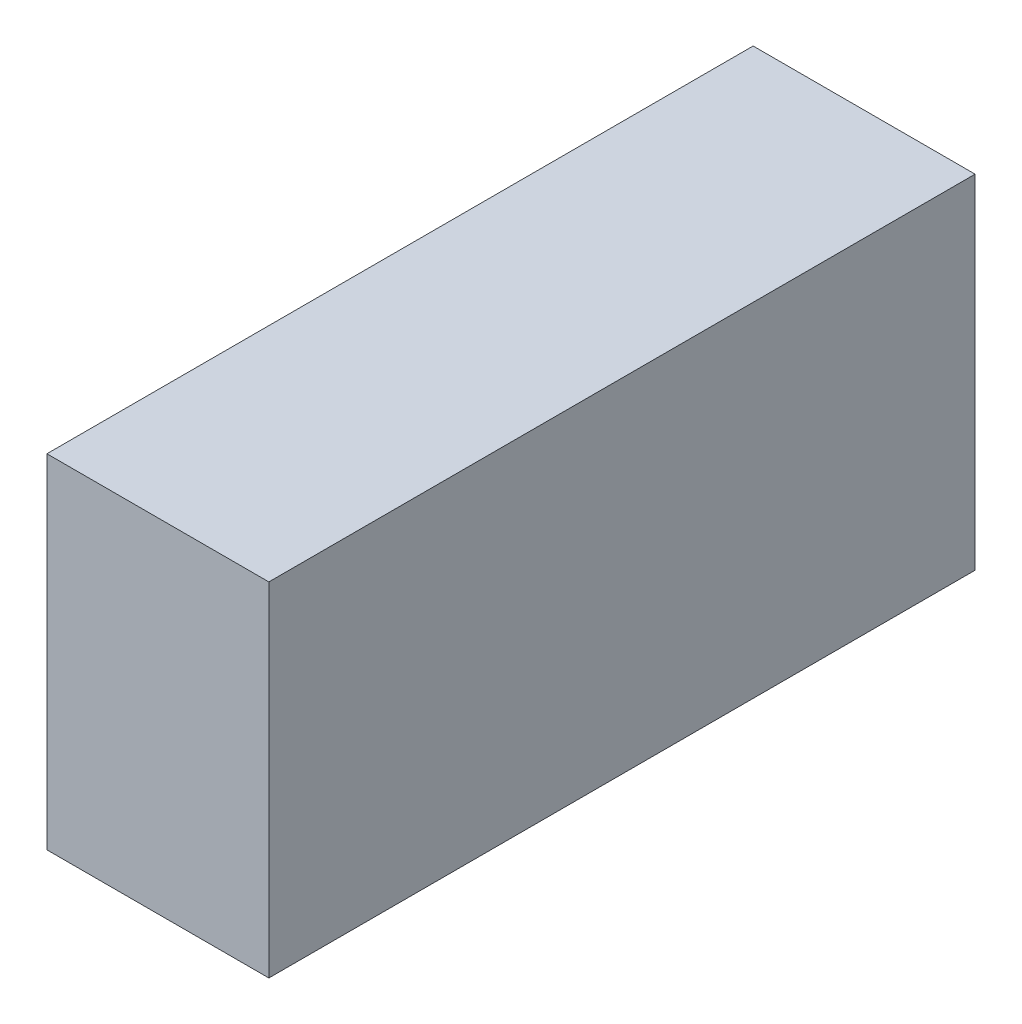
ISO-10303-21;
HEADER;
FILE_DESCRIPTION(('STEP AP214'),'2;1');
FILE_NAME('part.step','',(''),(''),'','','');
FILE_SCHEMA(('AUTOMOTIVE_DESIGN { 1 0 10303 214 1 1 1 1 }'));
ENDSEC;
DATA;
#1=APPLICATION_CONTEXT('core data for automotive mechanical design processes');
#2=APPLICATION_PROTOCOL_DEFINITION('international standard','automotive_design',2000,#1);
#3=PRODUCT_CONTEXT('',#1,'mechanical');
#4=PRODUCT('Part','Part','',(#3));
#5=PRODUCT_RELATED_PRODUCT_CATEGORY('part','',(#4));
#6=PRODUCT_DEFINITION_FORMATION('','',#4);
#7=PRODUCT_DEFINITION_CONTEXT('part definition',#1,'design');
#8=PRODUCT_DEFINITION('design','',#6,#7);
#9=PRODUCT_DEFINITION_SHAPE('','',#8);
#10=(LENGTH_UNIT() NAMED_UNIT(*) SI_UNIT(.MILLI.,.METRE.));
#11=(NAMED_UNIT(*) PLANE_ANGLE_UNIT() SI_UNIT($,.RADIAN.));
#12=(NAMED_UNIT(*) SI_UNIT($,.STERADIAN.) SOLID_ANGLE_UNIT());
#13=UNCERTAINTY_MEASURE_WITH_UNIT(LENGTH_MEASURE(1.E-05),#10,'distance_accuracy_value','');
#14=(GEOMETRIC_REPRESENTATION_CONTEXT(3) GLOBAL_UNCERTAINTY_ASSIGNED_CONTEXT((#13)) GLOBAL_UNIT_ASSIGNED_CONTEXT((#10,
#11,#12)) REPRESENTATION_CONTEXT('',''));
#15=CARTESIAN_POINT('',(0.,0.,0.));
#16=DIRECTION('',(0.,0.,1.));
#17=DIRECTION('',(1.,0.,0.));
#18=AXIS2_PLACEMENT_3D('',#15,#16,#17);
#19=CARTESIAN_POINT('',(11.,-17.,35.));
#20=DIRECTION('',(-1.,0.,0.));
#21=DIRECTION('',(0.,0.,1.));
#22=AXIS2_PLACEMENT_3D('',#19,#20,#21);
#23=PLANE('',#22);
#24=DIRECTION('',(0.,1.,0.));
#25=VECTOR('',#24,1.);
#26=CARTESIAN_POINT('',(11.,-17.,-35.));
#27=LINE('',#26,#25);
#28=CARTESIAN_POINT('',(11.,-17.,-35.));
#29=VERTEX_POINT('',#28);
#30=CARTESIAN_POINT('',(11.,17.,-35.));
#31=VERTEX_POINT('',#30);
#32=EDGE_CURVE('E100',#29,#31,#27,.T.);
#33=ORIENTED_EDGE('',*,*,#32,.T.);
#34=DIRECTION('',(0.,0.,-1.));
#35=VECTOR('',#34,1.);
#36=CARTESIAN_POINT('',(11.,17.,35.));
#37=LINE('',#36,#35);
#38=CARTESIAN_POINT('',(11.,17.,35.));
#39=VERTEX_POINT('',#38);
#40=EDGE_CURVE('E11',#39,#31,#37,.T.);
#41=ORIENTED_EDGE('',*,*,#40,.F.);
#42=DIRECTION('',(0.,1.,0.));
#43=VECTOR('',#42,1.);
#44=CARTESIAN_POINT('',(11.,-17.,35.));
#45=LINE('',#44,#43);
#46=CARTESIAN_POINT('',(11.,-17.,35.));
#47=VERTEX_POINT('',#46);
#48=EDGE_CURVE('E88',#47,#39,#45,.T.);
#49=ORIENTED_EDGE('',*,*,#48,.F.);
#50=DIRECTION('',(0.,0.,-1.));
#51=VECTOR('',#50,1.);
#52=CARTESIAN_POINT('',(11.,-17.,35.));
#53=LINE('',#52,#51);
#54=EDGE_CURVE('E96',#47,#29,#53,.T.);
#55=ORIENTED_EDGE('',*,*,#54,.T.);
#56=EDGE_LOOP('',(#33,#41,#49,#55));
#57=FACE_BOUND('',#56,.T.);
#58=ADVANCED_FACE('F37',(#57),#23,.F.);
#59=CARTESIAN_POINT('',(-11.,17.,35.));
#60=DIRECTION('',(0.,-1.,0.));
#61=DIRECTION('',(0.,0.,-1.));
#62=AXIS2_PLACEMENT_3D('',#59,#60,#61);
#63=PLANE('',#62);
#64=DIRECTION('',(-1.,0.,0.));
#65=VECTOR('',#64,1.);
#66=CARTESIAN_POINT('',(-11.,17.,-35.));
#67=LINE('',#66,#65);
#68=CARTESIAN_POINT('',(-11.,17.,-35.));
#69=VERTEX_POINT('',#68);
#70=EDGE_CURVE('E92',#31,#69,#67,.T.);
#71=ORIENTED_EDGE('',*,*,#70,.T.);
#72=DIRECTION('',(0.,0.,-1.));
#73=VECTOR('',#72,1.);
#74=CARTESIAN_POINT('',(-11.,17.,35.));
#75=LINE('',#74,#73);
#76=CARTESIAN_POINT('',(-11.,17.,35.));
#77=VERTEX_POINT('',#76);
#78=EDGE_CURVE('E45',#77,#69,#75,.T.);
#79=ORIENTED_EDGE('',*,*,#78,.F.);
#80=DIRECTION('',(-1.,0.,0.));
#81=VECTOR('',#80,1.);
#82=CARTESIAN_POINT('',(-11.,17.,35.));
#83=LINE('',#82,#81);
#84=EDGE_CURVE('E83',#39,#77,#83,.T.);
#85=ORIENTED_EDGE('',*,*,#84,.F.);
#86=ORIENTED_EDGE('',*,*,#40,.T.);
#87=EDGE_LOOP('',(#71,#79,#85,#86));
#88=FACE_BOUND('',#87,.T.);
#89=ADVANCED_FACE('F91',(#88),#63,.F.);
#90=CARTESIAN_POINT('',(-11.,-17.,35.));
#91=DIRECTION('',(1.,0.,0.));
#92=DIRECTION('',(0.,0.,-1.));
#93=AXIS2_PLACEMENT_3D('',#90,#91,#92);
#94=PLANE('',#93);
#95=DIRECTION('',(0.,-1.,0.));
#96=VECTOR('',#95,1.);
#97=CARTESIAN_POINT('',(-11.,-17.,-35.));
#98=LINE('',#97,#96);
#99=CARTESIAN_POINT('',(-11.,-17.,-35.));
#100=VERTEX_POINT('',#99);
#101=EDGE_CURVE('E70',#69,#100,#98,.T.);
#102=ORIENTED_EDGE('',*,*,#101,.T.);
#103=DIRECTION('',(0.,0.,-1.));
#104=VECTOR('',#103,1.);
#105=CARTESIAN_POINT('',(-11.,-17.,35.));
#106=LINE('',#105,#104);
#107=CARTESIAN_POINT('',(-11.,-17.,35.));
#108=VERTEX_POINT('',#107);
#109=EDGE_CURVE('E93',#108,#100,#106,.T.);
#110=ORIENTED_EDGE('',*,*,#109,.F.);
#111=DIRECTION('',(0.,-1.,0.));
#112=VECTOR('',#111,1.);
#113=CARTESIAN_POINT('',(-11.,-17.,35.));
#114=LINE('',#113,#112);
#115=EDGE_CURVE('E86',#77,#108,#114,.T.);
#116=ORIENTED_EDGE('',*,*,#115,.F.);
#117=ORIENTED_EDGE('',*,*,#78,.T.);
#118=EDGE_LOOP('',(#102,#110,#116,#117));
#119=FACE_BOUND('',#118,.T.);
#120=ADVANCED_FACE('F94',(#119),#94,.F.);
#121=CARTESIAN_POINT('',(-11.,-17.,35.));
#122=DIRECTION('',(0.,1.,0.));
#123=DIRECTION('',(0.,0.,1.));
#124=AXIS2_PLACEMENT_3D('',#121,#122,#123);
#125=PLANE('',#124);
#126=DIRECTION('',(1.,0.,0.));
#127=VECTOR('',#126,1.);
#128=CARTESIAN_POINT('',(-11.,-17.,-35.));
#129=LINE('',#128,#127);
#130=EDGE_CURVE('E76',#100,#29,#129,.T.);
#131=ORIENTED_EDGE('',*,*,#130,.T.);
#132=ORIENTED_EDGE('',*,*,#54,.F.);
#133=DIRECTION('',(1.,0.,0.));
#134=VECTOR('',#133,1.);
#135=CARTESIAN_POINT('',(-11.,-17.,35.));
#136=LINE('',#135,#134);
#137=EDGE_CURVE('E53',#108,#47,#136,.T.);
#138=ORIENTED_EDGE('',*,*,#137,.F.);
#139=ORIENTED_EDGE('',*,*,#109,.T.);
#140=EDGE_LOOP('',(#131,#132,#138,#139));
#141=FACE_BOUND('',#140,.T.);
#142=ADVANCED_FACE('F107',(#141),#125,.F.);
#143=CARTESIAN_POINT('',(0.,0.,35.));
#144=DIRECTION('',(0.,0.,-1.));
#145=DIRECTION('',(-1.,0.,0.));
#146=AXIS2_PLACEMENT_3D('',#143,#144,#145);
#147=PLANE('',#146);
#148=ORIENTED_EDGE('',*,*,#48,.T.);
#149=ORIENTED_EDGE('',*,*,#84,.T.);
#150=ORIENTED_EDGE('',*,*,#115,.T.);
#151=ORIENTED_EDGE('',*,*,#137,.T.);
#152=EDGE_LOOP('',(#148,#149,#150,#151));
#153=FACE_BOUND('',#152,.T.);
#154=ADVANCED_FACE('F84',(#153),#147,.F.);
#155=CARTESIAN_POINT('',(0.,0.,-35.));
#156=DIRECTION('',(0.,0.,-1.));
#157=DIRECTION('',(-1.,0.,0.));
#158=AXIS2_PLACEMENT_3D('',#155,#156,#157);
#159=PLANE('',#158);
#160=ORIENTED_EDGE('',*,*,#32,.F.);
#161=ORIENTED_EDGE('',*,*,#130,.F.);
#162=ORIENTED_EDGE('',*,*,#101,.F.);
#163=ORIENTED_EDGE('',*,*,#70,.F.);
#164=EDGE_LOOP('',(#160,#161,#162,#163));
#165=FACE_BOUND('',#164,.T.);
#166=ADVANCED_FACE('F110',(#165),#159,.T.);
#167=CLOSED_SHELL('',(#58,#89,#120,#142,#154,#166));
#168=MANIFOLD_SOLID_BREP('B2',#167);
#169=ADVANCED_BREP_SHAPE_REPRESENTATION('',(#18,#168),#14);
#170=SHAPE_DEFINITION_REPRESENTATION(#9,#169);
ENDSEC;
END-ISO-10303-21;
